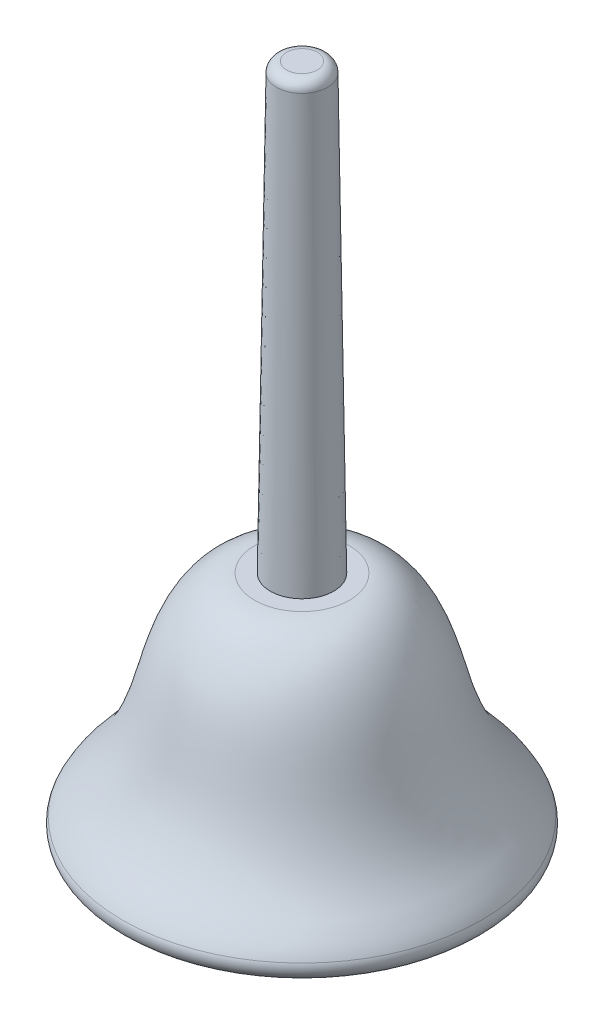
ISO-10303-21;
HEADER;
FILE_DESCRIPTION(('STEP AP214'),'2;1');
FILE_NAME('part.step','',(''),(''),'','','');
FILE_SCHEMA(('AUTOMOTIVE_DESIGN { 1 0 10303 214 1 1 1 1 }'));
ENDSEC;
DATA;
#1=APPLICATION_CONTEXT('core data for automotive mechanical design processes');
#2=APPLICATION_PROTOCOL_DEFINITION('international standard','automotive_design',2000,#1);
#3=PRODUCT_CONTEXT('',#1,'mechanical');
#4=PRODUCT('Part','Part','',(#3));
#5=PRODUCT_RELATED_PRODUCT_CATEGORY('part','',(#4));
#6=PRODUCT_DEFINITION_FORMATION('','',#4);
#7=PRODUCT_DEFINITION_CONTEXT('part definition',#1,'design');
#8=PRODUCT_DEFINITION('design','',#6,#7);
#9=PRODUCT_DEFINITION_SHAPE('','',#8);
#10=(LENGTH_UNIT() NAMED_UNIT(*) SI_UNIT(.MILLI.,.METRE.));
#11=(NAMED_UNIT(*) PLANE_ANGLE_UNIT() SI_UNIT($,.RADIAN.));
#12=(NAMED_UNIT(*) SI_UNIT($,.STERADIAN.) SOLID_ANGLE_UNIT());
#13=UNCERTAINTY_MEASURE_WITH_UNIT(LENGTH_MEASURE(1.E-05),#10,'distance_accuracy_value','');
#14=(GEOMETRIC_REPRESENTATION_CONTEXT(3) GLOBAL_UNCERTAINTY_ASSIGNED_CONTEXT((#13)) GLOBAL_UNIT_ASSIGNED_CONTEXT((#10,
#11,#12)) REPRESENTATION_CONTEXT('',''));
#15=CARTESIAN_POINT('',(0.,0.,0.));
#16=DIRECTION('',(0.,0.,1.));
#17=DIRECTION('',(1.,0.,0.));
#18=AXIS2_PLACEMENT_3D('',#15,#16,#17);
#19=CARTESIAN_POINT('',(-10.8599992898606,42.2775842053192,0.));
#20=CARTESIAN_POINT('',(-11.5795578866154,42.0554490420836,0.));
#21=CARTESIAN_POINT('',(-12.8893598946288,41.3849583453068,0.));
#22=CARTESIAN_POINT('',(-14.7788022244553,39.6266768886905,0.));
#23=CARTESIAN_POINT('',(-16.4418655133395,37.2647361664198,0.));
#24=CARTESIAN_POINT('',(-17.7990686699969,34.6129841970851,0.));
#25=CARTESIAN_POINT('',(-18.8847742160566,31.7926784055678,0.));
#26=CARTESIAN_POINT('',(-20.1116502875728,27.7858833787178,0.));
#27=CARTESIAN_POINT('',(-21.1844052369086,23.4851971732119,0.));
#28=CARTESIAN_POINT('',(-22.5809590528405,19.0112906840769,0.));
#29=CARTESIAN_POINT('',(-23.8743049967931,15.6808379480652,0.));
#30=CARTESIAN_POINT('',(-25.4574946114402,12.4223821713989,0.));
#31=CARTESIAN_POINT('',(-27.0621805598583,9.81950823090109,0.));
#32=CARTESIAN_POINT('',(-28.5520208762181,7.81947246141749,0.));
#33=CARTESIAN_POINT('',(-30.156998376134,5.94256401634801,0.));
#34=CARTESIAN_POINT('',(-31.602471782111,4.36878984332749,0.));
#35=CARTESIAN_POINT('',(-32.6575183207244,2.93574410336325,0.));
#36=CARTESIAN_POINT('',(-33.2165222781767,1.93848172418532,0.));
#37=CARTESIAN_POINT('',(-33.4972067360047,1.14074773747682,0.));
#38=CARTESIAN_POINT('',(-33.6177827721764,0.505898577949906,0.));
#39=CARTESIAN_POINT('',(-33.6476228021621,0.162121298363191,0.));
#40=CARTESIAN_POINT('',(-33.6545495196772,-0.0241805246126965,0.));
#41=CARTESIAN_POINT('',(-33.6554397137812,-0.055715546139771,0.));
#42=CARTESIAN_POINT('',(-33.6558481073407,-0.073380939811543,0.));
#43=B_SPLINE_CURVE_WITH_KNOTS('',3,(#19,#20,#21,#22,#23,#24,#25,#26,#27,#28,#29,#30,#31,#32,#33,
#34,#35,#36,#37,#38,#39,#40,#41,#42),.UNSPECIFIED.,.F.,.F.,(4,1,1,1,1,1,1,1,1,1,1,1,1,1,1,1,1,1,
1,1,1,4),(0.0409154236507554,0.100858209672583,0.160800995694411,0.220743781716239,
0.280686567738067,0.340629353759894,0.400572139781722,0.520457711825378,0.580400497847205,
0.640343283869033,0.700286069890861,0.760228855912689,0.790200248923603,0.820171641934517,
0.880114427956344,0.910085820967258,0.940057213978172,0.970028606989086,0.985014303494543,
0.997565826261486,0.998539495756891,1.),.UNSPECIFIED.);
#44=CARTESIAN_POINT('',(0.,48.006,0.));
#45=DIRECTION('',(0.,1.,0.));
#46=AXIS1_PLACEMENT('',#44,#45);
#47=SURFACE_OF_REVOLUTION('',#43,#46);
#48=CARTESIAN_POINT('',(0.,0.971136501988802,0.));
#49=DIRECTION('',(0.,1.,0.));
#50=DIRECTION('',(0.,0.,1.));
#51=AXIS2_PLACEMENT_3D('',#48,#49,#50);
#52=CIRCLE('',#51,33.5209257177884);
#53=CARTESIAN_POINT('',(0.,0.971136501988802,33.5209257177884));
#54=VERTEX_POINT('',#53);
#55=EDGE_CURVE('E47',#54,#54,#52,.F.);
#56=ORIENTED_EDGE('',*,*,#55,.T.);
#57=EDGE_LOOP('',(#56));
#58=FACE_BOUND('',#57,.T.);
#59=CARTESIAN_POINT('',(0.,42.2775842053192,0.));
#60=DIRECTION('',(0.,1.,0.));
#61=DIRECTION('',(0.,0.,1.));
#62=AXIS2_PLACEMENT_3D('',#59,#60,#61);
#63=CIRCLE('',#62,10.8599992898606);
#64=CARTESIAN_POINT('',(0.,42.2775842053192,10.8599992898606));
#65=VERTEX_POINT('',#64);
#66=EDGE_CURVE('E74',#65,#65,#63,.T.);
#67=ORIENTED_EDGE('',*,*,#66,.T.);
#68=EDGE_LOOP('',(#67));
#69=FACE_BOUND('',#68,.T.);
#70=ADVANCED_FACE('F39',(#58,#69),#47,.T.);
#71=CARTESIAN_POINT('',(-10.8599992898606,42.2775842053192,0.));
#72=CARTESIAN_POINT('',(-9.30798913547053,42.7184056421464,0.));
#73=CARTESIAN_POINT('',(-7.69628094070951,42.545,0.));
#74=B_SPLINE_CURVE_WITH_KNOTS('',2,(#71,#72,#73),.UNSPECIFIED.,.F.,.F.,(3,3),(0.,1.),.UNSPECIFIED.);
#75=CARTESIAN_POINT('',(0.,48.006,0.));
#76=DIRECTION('',(0.,1.,0.));
#77=AXIS1_PLACEMENT('',#75,#76);
#78=SURFACE_OF_REVOLUTION('',#74,#77);
#79=CARTESIAN_POINT('',(0.,42.545,0.));
#80=DIRECTION('',(0.,1.,0.));
#81=DIRECTION('',(0.,0.,1.));
#82=AXIS2_PLACEMENT_3D('',#79,#80,#81);
#83=CIRCLE('',#82,7.69628094070952);
#84=CARTESIAN_POINT('',(0.,42.545,7.69628094070952));
#85=VERTEX_POINT('',#84);
#86=EDGE_CURVE('E78',#85,#85,#83,.T.);
#87=ORIENTED_EDGE('',*,*,#86,.T.);
#88=EDGE_LOOP('',(#87));
#89=FACE_BOUND('',#88,.T.);
#90=ORIENTED_EDGE('',*,*,#66,.F.);
#91=EDGE_LOOP('',(#90));
#92=FACE_BOUND('',#91,.T.);
#93=ADVANCED_FACE('F110',(#89,#92),#78,.F.);
#94=CARTESIAN_POINT('',(0.,42.545,0.));
#95=DIRECTION('',(0.,1.,0.));
#96=DIRECTION('',(0.,0.,1.));
#97=AXIS2_PLACEMENT_3D('',#94,#95,#96);
#98=PLANE('',#97);
#99=CARTESIAN_POINT('',(0.,42.545,0.));
#100=DIRECTION('',(0.,1.,0.));
#101=DIRECTION('',(0.,0.,1.));
#102=AXIS2_PLACEMENT_3D('',#99,#100,#101);
#103=CIRCLE('',#102,2.54);
#104=CARTESIAN_POINT('',(0.,42.545,2.54));
#105=VERTEX_POINT('',#104);
#106=EDGE_CURVE('E68',#105,#105,#103,.T.);
#107=ORIENTED_EDGE('',*,*,#106,.T.);
#108=EDGE_LOOP('',(#107));
#109=FACE_BOUND('',#108,.T.);
#110=ORIENTED_EDGE('',*,*,#86,.F.);
#111=EDGE_LOOP('',(#110));
#112=FACE_BOUND('',#111,.T.);
#113=ADVANCED_FACE('F106',(#109,#112),#98,.F.);
#114=CARTESIAN_POINT('',(0.,45.72,0.));
#115=DIRECTION('',(0.,1.,0.));
#116=DIRECTION('',(0.,0.,1.));
#117=AXIS2_PLACEMENT_3D('',#114,#115,#116);
#118=PLANE('',#117);
#119=CARTESIAN_POINT('',(0.,45.72,0.));
#120=DIRECTION('',(0.,1.,0.));
#121=DIRECTION('',(-1.,0.,0.));
#122=AXIS2_PLACEMENT_3D('',#119,#120,#121);
#123=CIRCLE('',#122,6.35);
#124=CARTESIAN_POINT('',(-6.35,45.72,0.));
#125=VERTEX_POINT('',#124);
#126=EDGE_CURVE('E67',#125,#125,#123,.T.);
#127=ORIENTED_EDGE('',*,*,#126,.F.);
#128=EDGE_LOOP('',(#127));
#129=FACE_BOUND('',#128,.T.);
#130=CARTESIAN_POINT('',(0.,45.72,0.));
#131=DIRECTION('',(0.,1.,0.));
#132=DIRECTION('',(0.,0.,1.));
#133=AXIS2_PLACEMENT_3D('',#130,#131,#132);
#134=CIRCLE('',#133,9.49728765918653);
#135=CARTESIAN_POINT('',(0.,45.72,9.49728765918653));
#136=VERTEX_POINT('',#135);
#137=EDGE_CURVE('E72',#136,#136,#134,.T.);
#138=ORIENTED_EDGE('',*,*,#137,.T.);
#139=EDGE_LOOP('',(#138));
#140=FACE_BOUND('',#139,.T.);
#141=ADVANCED_FACE('F102',(#129,#140),#118,.T.);
#142=CARTESIAN_POINT('',(-9.49728765918653,45.72,0.));
#143=CARTESIAN_POINT('',(-14.2135297281993,45.4644950831123,0.));
#144=CARTESIAN_POINT('',(-21.7953255113801,37.1428909002855,0.));
#145=CARTESIAN_POINT('',(-24.0672118157485,22.5385905110065,0.));
#146=CARTESIAN_POINT('',(-30.0275227501035,9.53944412379154,0.));
#147=CARTESIAN_POINT('',(-36.7343058237079,4.1393289807167,0.));
#148=CARTESIAN_POINT('',(-36.83,0.,0.));
#149=B_SPLINE_CURVE_WITH_KNOTS('',3,(#142,#143,#144,#145,#146,#147,#148),.UNSPECIFIED.,.F.,.F.,
(4,1,1,1,4),(0.,0.238527214462069,0.556757743177852,0.795415437577043,1.),.UNSPECIFIED.);
#150=CARTESIAN_POINT('',(0.,48.006,0.));
#151=DIRECTION('',(0.,1.,0.));
#152=AXIS1_PLACEMENT('',#150,#151);
#153=SURFACE_OF_REVOLUTION('',#149,#152);
#154=CARTESIAN_POINT('',(0.,3.40978219942521,0.));
#155=DIRECTION('',(0.,1.,0.));
#156=DIRECTION('',(0.,0.,1.));
#157=AXIS2_PLACEMENT_3D('',#154,#155,#156);
#158=CIRCLE('',#157,35.9994057235326);
#159=CARTESIAN_POINT('',(0.,3.40978219942521,35.9994057235326));
#160=VERTEX_POINT('',#159);
#161=EDGE_CURVE('E10',#160,#160,#158,.T.);
#162=ORIENTED_EDGE('',*,*,#161,.T.);
#163=EDGE_LOOP('',(#162));
#164=FACE_BOUND('',#163,.T.);
#165=ORIENTED_EDGE('',*,*,#137,.F.);
#166=EDGE_LOOP('',(#165));
#167=FACE_BOUND('',#166,.T.);
#168=ADVANCED_FACE('F97',(#164,#167),#153,.F.);
#169=CARTESIAN_POINT('',(0.,134.62,0.));
#170=DIRECTION('',(0.,-1.,0.));
#171=DIRECTION('',(1.,0.,0.));
#172=AXIS2_PLACEMENT_3D('',#169,#170,#171);
#173=CONICAL_SURFACE('',#172,5.08,0.0142847425873966);
#174=CARTESIAN_POINT('',(0.,132.617025609783,0.));
#175=DIRECTION('',(0.,1.,0.));
#176=DIRECTION('',(-1.,0.,0.));
#177=AXIS2_PLACEMENT_3D('',#174,#175,#176);
#178=CIRCLE('',#177,5.10861391986025);
#179=CARTESIAN_POINT('',(-5.10861391986025,132.617025609783,0.));
#180=VERTEX_POINT('',#179);
#181=EDGE_CURVE('E57',#180,#180,#178,.F.);
#182=ORIENTED_EDGE('',*,*,#181,.T.);
#183=EDGE_LOOP('',(#182));
#184=FACE_BOUND('',#183,.T.);
#185=ORIENTED_EDGE('',*,*,#126,.T.);
#186=EDGE_LOOP('',(#185));
#187=FACE_BOUND('',#186,.T.);
#188=ADVANCED_FACE('F101',(#184,#187),#173,.T.);
#189=CARTESIAN_POINT('',(-5.08,134.62,0.));
#190=DIRECTION('',(0.,1.,0.));
#191=DIRECTION('',(-1.,0.,0.));
#192=AXIS2_PLACEMENT_3D('',#189,#190,#191);
#193=PLANE('',#192);
#194=CARTESIAN_POINT('',(0.,134.62,0.));
#195=DIRECTION('',(0.,1.,0.));
#196=DIRECTION('',(-1.,0.,0.));
#197=AXIS2_PLACEMENT_3D('',#194,#195,#196);
#198=CIRCLE('',#197,3.07682123506764);
#199=CARTESIAN_POINT('',(-3.07682123506764,134.62,0.));
#200=VERTEX_POINT('',#199);
#201=EDGE_CURVE('E63',#200,#200,#198,.T.);
#202=ORIENTED_EDGE('',*,*,#201,.T.);
#203=EDGE_LOOP('',(#202));
#204=FACE_BOUND('',#203,.T.);
#205=ADVANCED_FACE('F144',(#204),#193,.T.);
#206=CARTESIAN_POINT('',(0.,48.006,0.));
#207=DIRECTION('',(0.,1.,0.));
#208=DIRECTION('',(0.,0.,1.));
#209=AXIS2_PLACEMENT_3D('',#206,#207,#208);
#210=CYLINDRICAL_SURFACE('',#209,2.54);
#211=CARTESIAN_POINT('',(0.,17.78,0.));
#212=DIRECTION('',(0.,1.,0.));
#213=DIRECTION('',(0.,0.,1.));
#214=AXIS2_PLACEMENT_3D('',#211,#212,#213);
#215=CIRCLE('',#214,2.54);
#216=CARTESIAN_POINT('',(0.,17.78,2.54));
#217=VERTEX_POINT('',#216);
#218=EDGE_CURVE('E73',#217,#217,#215,.T.);
#219=ORIENTED_EDGE('',*,*,#218,.T.);
#220=EDGE_LOOP('',(#219));
#221=FACE_BOUND('',#220,.T.);
#222=ORIENTED_EDGE('',*,*,#106,.F.);
#223=EDGE_LOOP('',(#222));
#224=FACE_BOUND('',#223,.T.);
#225=ADVANCED_FACE('F132',(#221,#224),#210,.T.);
#226=CARTESIAN_POINT('',(0.,11.9601288674061,0.));
#227=DIRECTION('',(0.,1.,0.));
#228=DIRECTION('',(-1.,0.,0.));
#229=AXIS2_PLACEMENT_3D('',#226,#227,#228);
#230=SPHERICAL_SURFACE('',#229,6.35);
#231=ORIENTED_EDGE('',*,*,#218,.F.);
#232=EDGE_LOOP('',(#231));
#233=FACE_BOUND('',#232,.T.);
#234=ADVANCED_FACE('F135',(#233),#230,.T.);
#235=CARTESIAN_POINT('',(0.,132.588,0.));
#236=DIRECTION('',(0.,1.,0.));
#237=DIRECTION('',(-1.,0.,0.));
#238=AXIS2_PLACEMENT_3D('',#235,#236,#237);
#239=TOROIDAL_SURFACE('',#238,3.07682123506764,2.032);
#240=ORIENTED_EDGE('',*,*,#181,.F.);
#241=EDGE_LOOP('',(#240));
#242=FACE_BOUND('',#241,.T.);
#243=ORIENTED_EDGE('',*,*,#201,.F.);
#244=EDGE_LOOP('',(#243));
#245=FACE_BOUND('',#244,.T.);
#246=ADVANCED_FACE('F117',(#242,#245),#239,.T.);
#247=CARTESIAN_POINT('',(0.,1.27000000000006,0.));
#248=DIRECTION('',(0.,1.,0.));
#249=DIRECTION('',(0.,0.,1.));
#250=AXIS2_PLACEMENT_3D('',#247,#248,#249);
#251=TOROIDAL_SURFACE('',#250,34.7552597931329,1.27);
#252=ORIENTED_EDGE('',*,*,#55,.F.);
#253=EDGE_LOOP('',(#252));
#254=FACE_BOUND('',#253,.T.);
#255=CARTESIAN_POINT('',(0.,0.,0.));
#256=DIRECTION('',(0.,-1.,0.));
#257=DIRECTION('',(0.,0.,-1.));
#258=AXIS2_PLACEMENT_3D('',#255,#256,#257);
#259=CIRCLE('',#258,34.7552597931329);
#260=CARTESIAN_POINT('',(0.,0.,-34.7552597931329));
#261=VERTEX_POINT('',#260);
#262=EDGE_CURVE('E52',#261,#261,#259,.F.);
#263=ORIENTED_EDGE('',*,*,#262,.F.);
#264=EDGE_LOOP('',(#263));
#265=FACE_BOUND('',#264,.T.);
#266=ADVANCED_FACE('F142',(#254,#265),#251,.T.);
#267=CARTESIAN_POINT('',(0.,2.31401849676004,0.));
#268=DIRECTION('',(0.,1.,0.));
#269=DIRECTION('',(0.,0.,1.));
#270=AXIS2_PLACEMENT_3D('',#267,#268,#269);
#271=TOROIDAL_SURFACE('',#270,33.7079210720629,2.54);
#272=ORIENTED_EDGE('',*,*,#262,.T.);
#273=EDGE_LOOP('',(#272));
#274=FACE_BOUND('',#273,.T.);
#275=ORIENTED_EDGE('',*,*,#161,.F.);
#276=EDGE_LOOP('',(#275));
#277=FACE_BOUND('',#276,.T.);
#278=ADVANCED_FACE('F41',(#274,#277),#271,.T.);
#279=CLOSED_SHELL('',(#70,#93,#113,#141,#168,#188,#205,#225,#234,#246,#266,#278));
#280=MANIFOLD_SOLID_BREP('B2',#279);
#281=ADVANCED_BREP_SHAPE_REPRESENTATION('',(#18,#280),#14);
#282=SHAPE_DEFINITION_REPRESENTATION(#9,#281);
ENDSEC;
END-ISO-10303-21;
